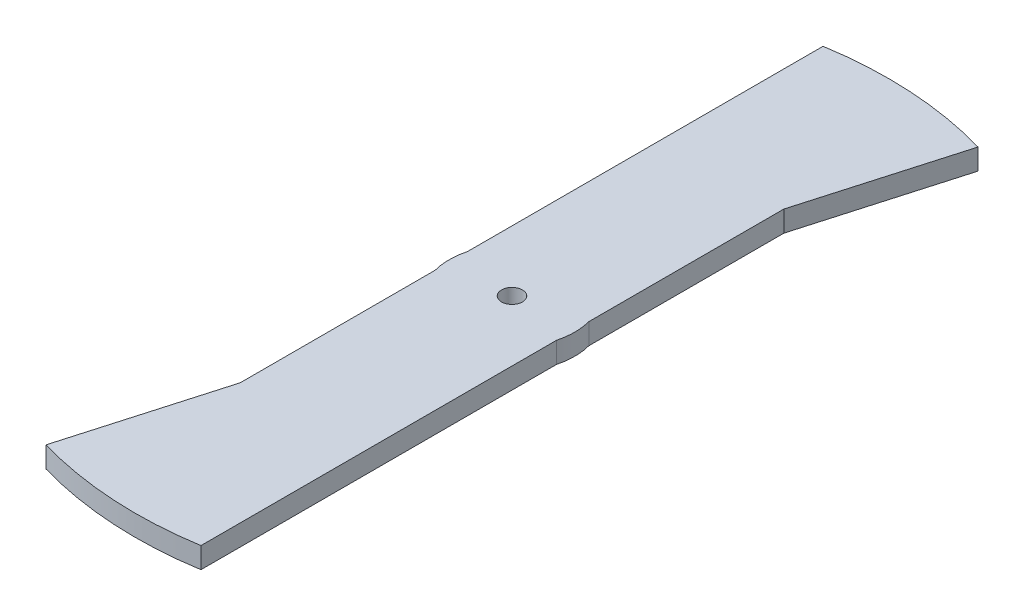
ISO-10303-21;
HEADER;
FILE_DESCRIPTION(('STEP AP214'),'2;1');
FILE_NAME('part.step','',(''),(''),'','','');
FILE_SCHEMA(('AUTOMOTIVE_DESIGN { 1 0 10303 214 1 1 1 1 }'));
ENDSEC;
DATA;
#1=APPLICATION_CONTEXT('core data for automotive mechanical design processes');
#2=APPLICATION_PROTOCOL_DEFINITION('international standard','automotive_design',2000,#1);
#3=PRODUCT_CONTEXT('',#1,'mechanical');
#4=PRODUCT('Part','Part','',(#3));
#5=PRODUCT_RELATED_PRODUCT_CATEGORY('part','',(#4));
#6=PRODUCT_DEFINITION_FORMATION('','',#4);
#7=PRODUCT_DEFINITION_CONTEXT('part definition',#1,'design');
#8=PRODUCT_DEFINITION('design','',#6,#7);
#9=PRODUCT_DEFINITION_SHAPE('','',#8);
#10=(LENGTH_UNIT() NAMED_UNIT(*) SI_UNIT(.MILLI.,.METRE.));
#11=(NAMED_UNIT(*) PLANE_ANGLE_UNIT() SI_UNIT($,.RADIAN.));
#12=(NAMED_UNIT(*) SI_UNIT($,.STERADIAN.) SOLID_ANGLE_UNIT());
#13=UNCERTAINTY_MEASURE_WITH_UNIT(LENGTH_MEASURE(1.E-05),#10,'distance_accuracy_value','');
#14=(GEOMETRIC_REPRESENTATION_CONTEXT(3) GLOBAL_UNCERTAINTY_ASSIGNED_CONTEXT((#13)) GLOBAL_UNIT_ASSIGNED_CONTEXT((#10,
#11,#12)) REPRESENTATION_CONTEXT('',''));
#15=CARTESIAN_POINT('',(0.,0.,0.));
#16=DIRECTION('',(0.,0.,1.));
#17=DIRECTION('',(1.,0.,0.));
#18=AXIS2_PLACEMENT_3D('',#15,#16,#17);
#19=CARTESIAN_POINT('',(0.,6.35,0.));
#20=DIRECTION('',(0.,-1.,0.));
#21=DIRECTION('',(0.,0.,-1.));
#22=AXIS2_PLACEMENT_3D('',#19,#20,#21);
#23=CYLINDRICAL_SURFACE('',#22,19.05);
#24=CARTESIAN_POINT('',(0.,0.,0.));
#25=DIRECTION('',(0.,1.,0.));
#26=DIRECTION('',(0.,0.,1.));
#27=AXIS2_PLACEMENT_3D('',#24,#25,#26);
#28=CIRCLE('',#27,19.05);
#29=CARTESIAN_POINT('',(18.415,0.,-4.87752754989657));
#30=VERTEX_POINT('',#29);
#31=CARTESIAN_POINT('',(18.415,0.,4.87752754989658));
#32=VERTEX_POINT('',#31);
#33=EDGE_CURVE('E145',#30,#32,#28,.F.);
#34=ORIENTED_EDGE('',*,*,#33,.F.);
#35=DIRECTION('',(0.,-1.,0.));
#36=VECTOR('',#35,1.);
#37=CARTESIAN_POINT('',(18.415,6.35,-4.87752754989657));
#38=LINE('',#37,#36);
#39=CARTESIAN_POINT('',(18.415,6.35,-4.87752754989657));
#40=VERTEX_POINT('',#39);
#41=EDGE_CURVE('E11',#40,#30,#38,.T.);
#42=ORIENTED_EDGE('',*,*,#41,.F.);
#43=CARTESIAN_POINT('',(0.,6.35,0.));
#44=DIRECTION('',(0.,1.,0.));
#45=DIRECTION('',(0.,0.,1.));
#46=AXIS2_PLACEMENT_3D('',#43,#44,#45);
#47=CIRCLE('',#46,19.05);
#48=CARTESIAN_POINT('',(18.415,6.35,4.87752754989658));
#49=VERTEX_POINT('',#48);
#50=EDGE_CURVE('E170',#40,#49,#47,.F.);
#51=ORIENTED_EDGE('',*,*,#50,.T.);
#52=DIRECTION('',(0.,-1.,0.));
#53=VECTOR('',#52,1.);
#54=CARTESIAN_POINT('',(18.415,6.35,4.87752754989658));
#55=LINE('',#54,#53);
#56=EDGE_CURVE('E91',#49,#32,#55,.T.);
#57=ORIENTED_EDGE('',*,*,#56,.T.);
#58=EDGE_LOOP('',(#34,#42,#51,#57));
#59=FACE_BOUND('',#58,.T.);
#60=ADVANCED_FACE('F35',(#59),#23,.T.);
#61=CARTESIAN_POINT('',(18.415,6.35,0.));
#62=DIRECTION('',(-1.,0.,0.));
#63=DIRECTION('',(0.,0.,1.));
#64=AXIS2_PLACEMENT_3D('',#61,#62,#63);
#65=PLANE('',#64);
#66=DIRECTION('',(0.,0.,-1.));
#67=VECTOR('',#66,1.);
#68=CARTESIAN_POINT('',(18.415,0.,0.));
#69=LINE('',#68,#67);
#70=CARTESIAN_POINT('',(18.415,0.,-64.0815371226378));
#71=VERTEX_POINT('',#70);
#72=EDGE_CURVE('E148',#30,#71,#69,.T.);
#73=ORIENTED_EDGE('',*,*,#72,.T.);
#74=DIRECTION('',(0.,-1.,0.));
#75=VECTOR('',#74,1.);
#76=CARTESIAN_POINT('',(18.415,6.35,-64.0815371226378));
#77=LINE('',#76,#75);
#78=CARTESIAN_POINT('',(18.415,6.35,-64.0815371226378));
#79=VERTEX_POINT('',#78);
#80=EDGE_CURVE('E43',#79,#71,#77,.T.);
#81=ORIENTED_EDGE('',*,*,#80,.F.);
#82=DIRECTION('',(0.,0.,-1.));
#83=VECTOR('',#82,1.);
#84=CARTESIAN_POINT('',(18.415,6.35,0.));
#85=LINE('',#84,#83);
#86=EDGE_CURVE('E209',#40,#79,#85,.T.);
#87=ORIENTED_EDGE('',*,*,#86,.F.);
#88=ORIENTED_EDGE('',*,*,#41,.T.);
#89=EDGE_LOOP('',(#73,#81,#87,#88));
#90=FACE_BOUND('',#89,.T.);
#91=ADVANCED_FACE('F223',(#90),#65,.F.);
#92=CARTESIAN_POINT('',(0.,6.35,0.));
#93=DIRECTION('',(-0.961102918974694,0.,-0.276190476190476));
#94=DIRECTION('',(-0.276190476190476,0.,0.961102918974695));
#95=AXIS2_PLACEMENT_3D('',#92,#93,#94);
#96=PLANE('',#95);
#97=DIRECTION('',(0.276190476190476,0.,-0.961102918974695));
#98=VECTOR('',#97,1.);
#99=CARTESIAN_POINT('',(0.,0.,0.));
#100=LINE('',#99,#98);
#101=CARTESIAN_POINT('',(31.5685714285714,0.,-109.854063638808));
#102=VERTEX_POINT('',#101);
#103=EDGE_CURVE('E150',#71,#102,#100,.T.);
#104=ORIENTED_EDGE('',*,*,#103,.T.);
#105=DIRECTION('',(0.,-1.,0.));
#106=VECTOR('',#105,1.);
#107=CARTESIAN_POINT('',(31.5685714285714,6.35,-109.854063638808));
#108=LINE('',#107,#106);
#109=CARTESIAN_POINT('',(31.5685714285714,6.35,-109.854063638808));
#110=VERTEX_POINT('',#109);
#111=EDGE_CURVE('E182',#110,#102,#108,.T.);
#112=ORIENTED_EDGE('',*,*,#111,.F.);
#113=DIRECTION('',(0.276190476190476,0.,-0.961102918974695));
#114=VECTOR('',#113,1.);
#115=CARTESIAN_POINT('',(0.,6.35,0.));
#116=LINE('',#115,#114);
#117=EDGE_CURVE('E190',#79,#110,#116,.T.);
#118=ORIENTED_EDGE('',*,*,#117,.F.);
#119=ORIENTED_EDGE('',*,*,#80,.T.);
#120=EDGE_LOOP('',(#104,#112,#118,#119));
#121=FACE_BOUND('',#120,.T.);
#122=ADVANCED_FACE('F188',(#121),#96,.F.);
#123=CARTESIAN_POINT('',(0.,6.35,0.));
#124=DIRECTION('',(0.,-1.,0.));
#125=DIRECTION('',(0.,0.,-1.));
#126=AXIS2_PLACEMENT_3D('',#123,#124,#125);
#127=CYLINDRICAL_SURFACE('',#126,114.3);
#128=CARTESIAN_POINT('',(0.,0.,0.));
#129=DIRECTION('',(0.,1.,0.));
#130=DIRECTION('',(0.,0.,1.));
#131=AXIS2_PLACEMENT_3D('',#128,#129,#130);
#132=CIRCLE('',#131,114.3);
#133=CARTESIAN_POINT('',(-18.415,0.,-112.806816172605));
#134=VERTEX_POINT('',#133);
#135=EDGE_CURVE('E153',#134,#102,#132,.F.);
#136=ORIENTED_EDGE('',*,*,#135,.F.);
#137=DIRECTION('',(0.,-1.,0.));
#138=VECTOR('',#137,1.);
#139=CARTESIAN_POINT('',(-18.415,6.35,-112.806816172605));
#140=LINE('',#139,#138);
#141=CARTESIAN_POINT('',(-18.415,6.35,-112.806816172605));
#142=VERTEX_POINT('',#141);
#143=EDGE_CURVE('E180',#142,#134,#140,.T.);
#144=ORIENTED_EDGE('',*,*,#143,.F.);
#145=CARTESIAN_POINT('',(0.,6.35,0.));
#146=DIRECTION('',(0.,1.,0.));
#147=DIRECTION('',(0.,0.,1.));
#148=AXIS2_PLACEMENT_3D('',#145,#146,#147);
#149=CIRCLE('',#148,114.3);
#150=EDGE_CURVE('E204',#142,#110,#149,.F.);
#151=ORIENTED_EDGE('',*,*,#150,.T.);
#152=ORIENTED_EDGE('',*,*,#111,.T.);
#153=EDGE_LOOP('',(#136,#144,#151,#152));
#154=FACE_BOUND('',#153,.T.);
#155=ADVANCED_FACE('F200',(#154),#127,.T.);
#156=CARTESIAN_POINT('',(-18.415,6.35,0.));
#157=DIRECTION('',(1.,0.,0.));
#158=DIRECTION('',(0.,0.,-1.));
#159=AXIS2_PLACEMENT_3D('',#156,#157,#158);
#160=PLANE('',#159);
#161=DIRECTION('',(0.,0.,1.));
#162=VECTOR('',#161,1.);
#163=CARTESIAN_POINT('',(-18.415,0.,0.));
#164=LINE('',#163,#162);
#165=CARTESIAN_POINT('',(-18.415,0.,-4.87752754989657));
#166=VERTEX_POINT('',#165);
#167=EDGE_CURVE('E156',#134,#166,#164,.T.);
#168=ORIENTED_EDGE('',*,*,#167,.T.);
#169=DIRECTION('',(0.,-1.,0.));
#170=VECTOR('',#169,1.);
#171=CARTESIAN_POINT('',(-18.415,6.35,-4.87752754989657));
#172=LINE('',#171,#170);
#173=CARTESIAN_POINT('',(-18.415,6.35,-4.87752754989657));
#174=VERTEX_POINT('',#173);
#175=EDGE_CURVE('E177',#174,#166,#172,.T.);
#176=ORIENTED_EDGE('',*,*,#175,.F.);
#177=DIRECTION('',(0.,0.,1.));
#178=VECTOR('',#177,1.);
#179=CARTESIAN_POINT('',(-18.415,6.35,0.));
#180=LINE('',#179,#178);
#181=EDGE_CURVE('E205',#142,#174,#180,.T.);
#182=ORIENTED_EDGE('',*,*,#181,.F.);
#183=ORIENTED_EDGE('',*,*,#143,.T.);
#184=EDGE_LOOP('',(#168,#176,#182,#183));
#185=FACE_BOUND('',#184,.T.);
#186=ADVANCED_FACE('F233',(#185),#160,.F.);
#187=CARTESIAN_POINT('',(0.,6.35,0.));
#188=DIRECTION('',(0.,-1.,0.));
#189=DIRECTION('',(0.,0.,-1.));
#190=AXIS2_PLACEMENT_3D('',#187,#188,#189);
#191=CYLINDRICAL_SURFACE('',#190,19.05);
#192=CARTESIAN_POINT('',(0.,0.,0.));
#193=DIRECTION('',(0.,1.,0.));
#194=DIRECTION('',(0.,0.,1.));
#195=AXIS2_PLACEMENT_3D('',#192,#193,#194);
#196=CIRCLE('',#195,19.05);
#197=CARTESIAN_POINT('',(-18.415,0.,4.87752754989657));
#198=VERTEX_POINT('',#197);
#199=EDGE_CURVE('E158',#166,#198,#196,.T.);
#200=ORIENTED_EDGE('',*,*,#199,.T.);
#201=DIRECTION('',(0.,-1.,0.));
#202=VECTOR('',#201,1.);
#203=CARTESIAN_POINT('',(-18.415,6.35,4.87752754989657));
#204=LINE('',#203,#202);
#205=CARTESIAN_POINT('',(-18.415,6.35,4.87752754989657));
#206=VERTEX_POINT('',#205);
#207=EDGE_CURVE('E174',#206,#198,#204,.T.);
#208=ORIENTED_EDGE('',*,*,#207,.F.);
#209=CARTESIAN_POINT('',(0.,6.35,0.));
#210=DIRECTION('',(0.,1.,0.));
#211=DIRECTION('',(0.,0.,1.));
#212=AXIS2_PLACEMENT_3D('',#209,#210,#211);
#213=CIRCLE('',#212,19.05);
#214=EDGE_CURVE('E207',#174,#206,#213,.T.);
#215=ORIENTED_EDGE('',*,*,#214,.F.);
#216=ORIENTED_EDGE('',*,*,#175,.T.);
#217=EDGE_LOOP('',(#200,#208,#215,#216));
#218=FACE_BOUND('',#217,.T.);
#219=ADVANCED_FACE('F217',(#218),#191,.T.);
#220=CARTESIAN_POINT('',(-18.415,6.35,0.));
#221=DIRECTION('',(1.,0.,0.));
#222=DIRECTION('',(0.,0.,-1.));
#223=AXIS2_PLACEMENT_3D('',#220,#221,#222);
#224=PLANE('',#223);
#225=DIRECTION('',(0.,0.,1.));
#226=VECTOR('',#225,1.);
#227=CARTESIAN_POINT('',(-18.415,0.,0.));
#228=LINE('',#227,#226);
#229=CARTESIAN_POINT('',(-18.415,0.,64.0815371226377));
#230=VERTEX_POINT('',#229);
#231=EDGE_CURVE('E160',#198,#230,#228,.T.);
#232=ORIENTED_EDGE('',*,*,#231,.T.);
#233=DIRECTION('',(0.,-1.,0.));
#234=VECTOR('',#233,1.);
#235=CARTESIAN_POINT('',(-18.415,6.35,64.0815371226377));
#236=LINE('',#235,#234);
#237=CARTESIAN_POINT('',(-18.415,6.35,64.0815371226377));
#238=VERTEX_POINT('',#237);
#239=EDGE_CURVE('E135',#238,#230,#236,.T.);
#240=ORIENTED_EDGE('',*,*,#239,.F.);
#241=DIRECTION('',(0.,0.,1.));
#242=VECTOR('',#241,1.);
#243=CARTESIAN_POINT('',(-18.415,6.35,0.));
#244=LINE('',#243,#242);
#245=EDGE_CURVE('E122',#206,#238,#244,.T.);
#246=ORIENTED_EDGE('',*,*,#245,.F.);
#247=ORIENTED_EDGE('',*,*,#207,.T.);
#248=EDGE_LOOP('',(#232,#240,#246,#247));
#249=FACE_BOUND('',#248,.T.);
#250=ADVANCED_FACE('F220',(#249),#224,.F.);
#251=CARTESIAN_POINT('',(0.,6.35,0.));
#252=DIRECTION('',(0.961102918974694,0.,0.276190476190476));
#253=DIRECTION('',(0.276190476190476,0.,-0.961102918974694));
#254=AXIS2_PLACEMENT_3D('',#251,#252,#253);
#255=PLANE('',#254);
#256=DIRECTION('',(-0.276190476190476,0.,0.961102918974694));
#257=VECTOR('',#256,1.);
#258=CARTESIAN_POINT('',(0.,0.,0.));
#259=LINE('',#258,#257);
#260=CARTESIAN_POINT('',(-31.5685714285715,0.,109.854063638808));
#261=VERTEX_POINT('',#260);
#262=EDGE_CURVE('E131',#230,#261,#259,.T.);
#263=ORIENTED_EDGE('',*,*,#262,.T.);
#264=DIRECTION('',(0.,-1.,0.));
#265=VECTOR('',#264,1.);
#266=CARTESIAN_POINT('',(-31.5685714285715,6.35,109.854063638808));
#267=LINE('',#266,#265);
#268=CARTESIAN_POINT('',(-31.5685714285715,6.35,109.854063638808));
#269=VERTEX_POINT('',#268);
#270=EDGE_CURVE('E128',#269,#261,#267,.T.);
#271=ORIENTED_EDGE('',*,*,#270,.F.);
#272=DIRECTION('',(-0.276190476190476,0.,0.961102918974694));
#273=VECTOR('',#272,1.);
#274=CARTESIAN_POINT('',(0.,6.35,0.));
#275=LINE('',#274,#273);
#276=EDGE_CURVE('E115',#238,#269,#275,.T.);
#277=ORIENTED_EDGE('',*,*,#276,.F.);
#278=ORIENTED_EDGE('',*,*,#239,.T.);
#279=EDGE_LOOP('',(#263,#271,#277,#278));
#280=FACE_BOUND('',#279,.T.);
#281=ADVANCED_FACE('F129',(#280),#255,.F.);
#282=CARTESIAN_POINT('',(0.,6.35,0.));
#283=DIRECTION('',(0.,-1.,0.));
#284=DIRECTION('',(0.,0.,-1.));
#285=AXIS2_PLACEMENT_3D('',#282,#283,#284);
#286=CYLINDRICAL_SURFACE('',#285,114.3);
#287=CARTESIAN_POINT('',(0.,0.,0.));
#288=DIRECTION('',(0.,1.,0.));
#289=DIRECTION('',(0.,0.,1.));
#290=AXIS2_PLACEMENT_3D('',#287,#288,#289);
#291=CIRCLE('',#290,114.3);
#292=CARTESIAN_POINT('',(18.4149999999999,0.,112.806816172605));
#293=VERTEX_POINT('',#292);
#294=EDGE_CURVE('E163',#293,#261,#291,.F.);
#295=ORIENTED_EDGE('',*,*,#294,.F.);
#296=DIRECTION('',(0.,-1.,0.));
#297=VECTOR('',#296,1.);
#298=CARTESIAN_POINT('',(18.4149999999999,6.35,112.806816172605));
#299=LINE('',#298,#297);
#300=CARTESIAN_POINT('',(18.4149999999999,6.35,112.806816172605));
#301=VERTEX_POINT('',#300);
#302=EDGE_CURVE('E84',#301,#293,#299,.T.);
#303=ORIENTED_EDGE('',*,*,#302,.F.);
#304=CARTESIAN_POINT('',(0.,6.35,0.));
#305=DIRECTION('',(0.,1.,0.));
#306=DIRECTION('',(0.,0.,1.));
#307=AXIS2_PLACEMENT_3D('',#304,#305,#306);
#308=CIRCLE('',#307,114.3);
#309=EDGE_CURVE('E120',#301,#269,#308,.F.);
#310=ORIENTED_EDGE('',*,*,#309,.T.);
#311=ORIENTED_EDGE('',*,*,#270,.T.);
#312=EDGE_LOOP('',(#295,#303,#310,#311));
#313=FACE_BOUND('',#312,.T.);
#314=ADVANCED_FACE('F137',(#313),#286,.T.);
#315=CARTESIAN_POINT('',(18.415,6.35,0.));
#316=DIRECTION('',(-1.,0.,0.));
#317=DIRECTION('',(0.,0.,1.));
#318=AXIS2_PLACEMENT_3D('',#315,#316,#317);
#319=PLANE('',#318);
#320=DIRECTION('',(0.,0.,-1.));
#321=VECTOR('',#320,1.);
#322=CARTESIAN_POINT('',(18.415,0.,0.));
#323=LINE('',#322,#321);
#324=EDGE_CURVE('E165',#293,#32,#323,.T.);
#325=ORIENTED_EDGE('',*,*,#324,.T.);
#326=ORIENTED_EDGE('',*,*,#56,.F.);
#327=DIRECTION('',(0.,0.,-1.));
#328=VECTOR('',#327,1.);
#329=CARTESIAN_POINT('',(18.415,6.35,0.));
#330=LINE('',#329,#328);
#331=EDGE_CURVE('E51',#301,#49,#330,.T.);
#332=ORIENTED_EDGE('',*,*,#331,.F.);
#333=ORIENTED_EDGE('',*,*,#302,.T.);
#334=EDGE_LOOP('',(#325,#326,#332,#333));
#335=FACE_BOUND('',#334,.T.);
#336=ADVANCED_FACE('F221',(#335),#319,.F.);
#337=CARTESIAN_POINT('',(0.,6.35,0.));
#338=DIRECTION('',(0.,-1.,0.));
#339=DIRECTION('',(0.,0.,-1.));
#340=AXIS2_PLACEMENT_3D('',#337,#338,#339);
#341=CYLINDRICAL_SURFACE('',#340,3.175);
#342=CARTESIAN_POINT('',(0.,6.35,0.));
#343=DIRECTION('',(0.,1.,0.));
#344=DIRECTION('',(0.,0.,1.));
#345=AXIS2_PLACEMENT_3D('',#342,#343,#344);
#346=CIRCLE('',#345,3.175);
#347=CARTESIAN_POINT('',(0.,6.35,3.175));
#348=VERTEX_POINT('',#347);
#349=EDGE_CURVE('E139',#348,#348,#346,.T.);
#350=ORIENTED_EDGE('',*,*,#349,.T.);
#351=EDGE_LOOP('',(#350));
#352=FACE_BOUND('',#351,.T.);
#353=CARTESIAN_POINT('',(0.,0.,0.));
#354=DIRECTION('',(0.,1.,0.));
#355=DIRECTION('',(0.,0.,1.));
#356=AXIS2_PLACEMENT_3D('',#353,#354,#355);
#357=CIRCLE('',#356,3.175);
#358=CARTESIAN_POINT('',(0.,0.,3.175));
#359=VERTEX_POINT('',#358);
#360=EDGE_CURVE('E167',#359,#359,#357,.T.);
#361=ORIENTED_EDGE('',*,*,#360,.F.);
#362=EDGE_LOOP('',(#361));
#363=FACE_BOUND('',#362,.T.);
#364=ADVANCED_FACE('F247',(#352,#363),#341,.F.);
#365=CARTESIAN_POINT('',(0.,6.35,0.));
#366=DIRECTION('',(0.,1.,0.));
#367=DIRECTION('',(0.,0.,1.));
#368=AXIS2_PLACEMENT_3D('',#365,#366,#367);
#369=PLANE('',#368);
#370=ORIENTED_EDGE('',*,*,#50,.F.);
#371=ORIENTED_EDGE('',*,*,#86,.T.);
#372=ORIENTED_EDGE('',*,*,#117,.T.);
#373=ORIENTED_EDGE('',*,*,#150,.F.);
#374=ORIENTED_EDGE('',*,*,#181,.T.);
#375=ORIENTED_EDGE('',*,*,#214,.T.);
#376=ORIENTED_EDGE('',*,*,#245,.T.);
#377=ORIENTED_EDGE('',*,*,#276,.T.);
#378=ORIENTED_EDGE('',*,*,#309,.F.);
#379=ORIENTED_EDGE('',*,*,#331,.T.);
#380=EDGE_LOOP('',(#370,#371,#372,#373,#374,#375,#376,#377,#378,#379));
#381=FACE_BOUND('',#380,.T.);
#382=ORIENTED_EDGE('',*,*,#349,.F.);
#383=EDGE_LOOP('',(#382));
#384=FACE_BOUND('',#383,.T.);
#385=ADVANCED_FACE('F117',(#381,#384),#369,.T.);
#386=CARTESIAN_POINT('',(0.,0.,0.));
#387=DIRECTION('',(0.,1.,0.));
#388=DIRECTION('',(0.,0.,1.));
#389=AXIS2_PLACEMENT_3D('',#386,#387,#388);
#390=PLANE('',#389);
#391=ORIENTED_EDGE('',*,*,#33,.T.);
#392=ORIENTED_EDGE('',*,*,#324,.F.);
#393=ORIENTED_EDGE('',*,*,#294,.T.);
#394=ORIENTED_EDGE('',*,*,#262,.F.);
#395=ORIENTED_EDGE('',*,*,#231,.F.);
#396=ORIENTED_EDGE('',*,*,#199,.F.);
#397=ORIENTED_EDGE('',*,*,#167,.F.);
#398=ORIENTED_EDGE('',*,*,#135,.T.);
#399=ORIENTED_EDGE('',*,*,#103,.F.);
#400=ORIENTED_EDGE('',*,*,#72,.F.);
#401=EDGE_LOOP('',(#391,#392,#393,#394,#395,#396,#397,#398,#399,#400));
#402=FACE_BOUND('',#401,.T.);
#403=ORIENTED_EDGE('',*,*,#360,.T.);
#404=EDGE_LOOP('',(#403));
#405=FACE_BOUND('',#404,.T.);
#406=ADVANCED_FACE('F194',(#402,#405),#390,.F.);
#407=CLOSED_SHELL('',(#60,#91,#122,#155,#186,#219,#250,#281,#314,#336,#364,#385,#406));
#408=MANIFOLD_SOLID_BREP('B2',#407);
#409=ADVANCED_BREP_SHAPE_REPRESENTATION('',(#18,#408),#14);
#410=SHAPE_DEFINITION_REPRESENTATION(#9,#409);
ENDSEC;
END-ISO-10303-21;
